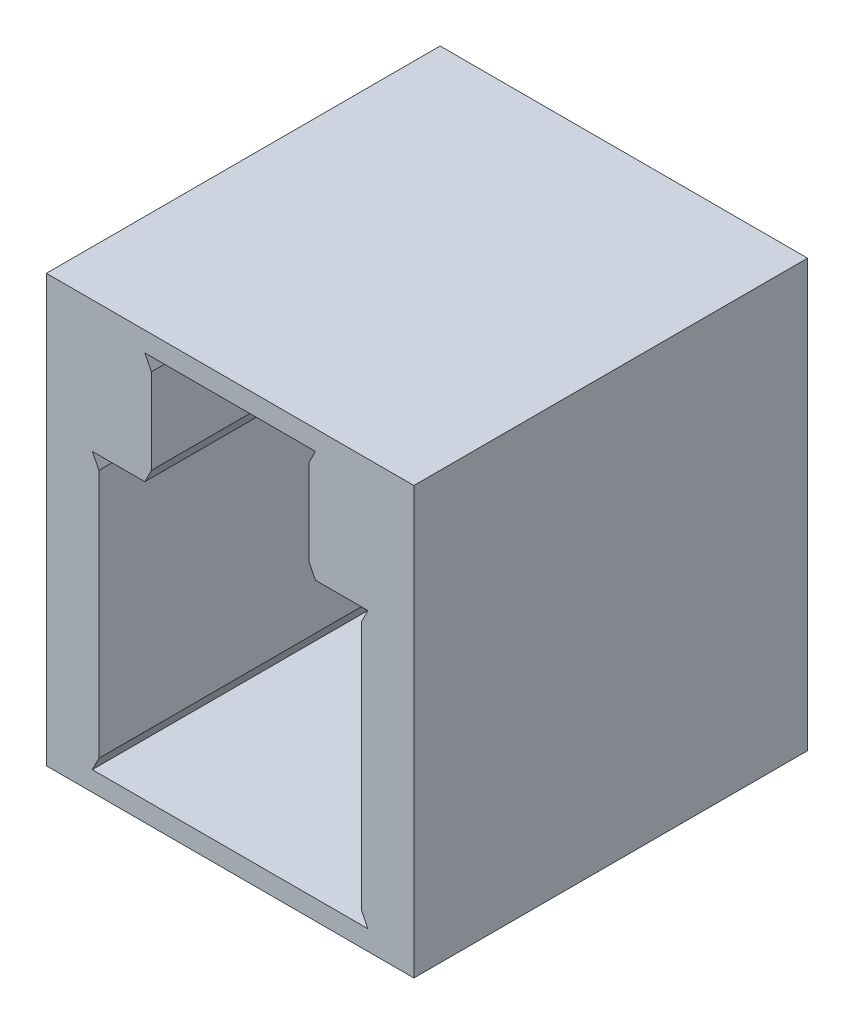
ISO-10303-21;
HEADER;
FILE_DESCRIPTION(('STEP AP214'),'2;1');
FILE_NAME('part.step','',(''),(''),'','','');
FILE_SCHEMA(('AUTOMOTIVE_DESIGN { 1 0 10303 214 1 1 1 1 }'));
ENDSEC;
DATA;
#1=APPLICATION_CONTEXT('core data for automotive mechanical design processes');
#2=APPLICATION_PROTOCOL_DEFINITION('international standard','automotive_design',2000,#1);
#3=PRODUCT_CONTEXT('',#1,'mechanical');
#4=PRODUCT('Part','Part','',(#3));
#5=PRODUCT_RELATED_PRODUCT_CATEGORY('part','',(#4));
#6=PRODUCT_DEFINITION_FORMATION('','',#4);
#7=PRODUCT_DEFINITION_CONTEXT('part definition',#1,'design');
#8=PRODUCT_DEFINITION('design','',#6,#7);
#9=PRODUCT_DEFINITION_SHAPE('','',#8);
#10=(LENGTH_UNIT() NAMED_UNIT(*) SI_UNIT(.MILLI.,.METRE.));
#11=(NAMED_UNIT(*) PLANE_ANGLE_UNIT() SI_UNIT($,.RADIAN.));
#12=(NAMED_UNIT(*) SI_UNIT($,.STERADIAN.) SOLID_ANGLE_UNIT());
#13=UNCERTAINTY_MEASURE_WITH_UNIT(LENGTH_MEASURE(1.E-05),#10,'distance_accuracy_value','');
#14=(GEOMETRIC_REPRESENTATION_CONTEXT(3) GLOBAL_UNCERTAINTY_ASSIGNED_CONTEXT((#13)) GLOBAL_UNIT_ASSIGNED_CONTEXT((#10,
#11,#12)) REPRESENTATION_CONTEXT('',''));
#15=CARTESIAN_POINT('',(0.,0.,0.));
#16=DIRECTION('',(0.,0.,1.));
#17=DIRECTION('',(1.,0.,0.));
#18=AXIS2_PLACEMENT_3D('',#15,#16,#17);
#19=CARTESIAN_POINT('',(4.,22.5,-30.));
#20=DIRECTION('',(0.,1.,0.));
#21=DIRECTION('',(-1.,0.,0.));
#22=AXIS2_PLACEMENT_3D('',#19,#20,#21);
#23=PLANE('',#22);
#24=DIRECTION('',(-1.,0.,0.));
#25=VECTOR('',#24,1.);
#26=CARTESIAN_POINT('',(4.,22.5,-30.));
#27=LINE('',#26,#25);
#28=CARTESIAN_POINT('',(7.5,22.5,-30.));
#29=VERTEX_POINT('',#28);
#30=CARTESIAN_POINT('',(3.5,22.5,-30.));
#31=VERTEX_POINT('',#30);
#32=EDGE_CURVE('E238',#29,#31,#27,.T.);
#33=ORIENTED_EDGE('',*,*,#32,.F.);
#34=DIRECTION('',(0.,0.,1.));
#35=VECTOR('',#34,1.);
#36=CARTESIAN_POINT('',(7.5,22.5,-30.));
#37=LINE('',#36,#35);
#38=CARTESIAN_POINT('',(7.5,22.5,0.));
#39=VERTEX_POINT('',#38);
#40=EDGE_CURVE('E371',#29,#39,#37,.T.);
#41=ORIENTED_EDGE('',*,*,#40,.T.);
#42=DIRECTION('',(1.,0.,0.));
#43=VECTOR('',#42,1.);
#44=CARTESIAN_POINT('',(0.,22.5,0.));
#45=LINE('',#44,#43);
#46=CARTESIAN_POINT('',(3.5,22.5,0.));
#47=VERTEX_POINT('',#46);
#48=EDGE_CURVE('E247',#47,#39,#45,.T.);
#49=ORIENTED_EDGE('',*,*,#48,.F.);
#50=DIRECTION('',(0.,0.,1.));
#51=VECTOR('',#50,1.);
#52=CARTESIAN_POINT('',(3.5,22.5,-30.));
#53=LINE('',#52,#51);
#54=EDGE_CURVE('E476',#31,#47,#53,.T.);
#55=ORIENTED_EDGE('',*,*,#54,.F.);
#56=EDGE_LOOP('',(#33,#41,#49,#55));
#57=FACE_BOUND('',#56,.T.);
#58=ADVANCED_FACE('F39',(#57),#23,.F.);
#59=CARTESIAN_POINT('',(0.,32.5,0.));
#60=DIRECTION('',(1.,0.,0.));
#61=DIRECTION('',(0.,0.,-1.));
#62=AXIS2_PLACEMENT_3D('',#59,#60,#61);
#63=PLANE('',#62);
#64=DIRECTION('',(0.,0.,1.));
#65=VECTOR('',#64,1.);
#66=CARTESIAN_POINT('',(0.,0.,0.));
#67=LINE('',#66,#65);
#68=CARTESIAN_POINT('',(0.,0.,-30.));
#69=VERTEX_POINT('',#68);
#70=CARTESIAN_POINT('',(0.,0.,0.));
#71=VERTEX_POINT('',#70);
#72=EDGE_CURVE('E267',#69,#71,#67,.T.);
#73=ORIENTED_EDGE('',*,*,#72,.T.);
#74=DIRECTION('',(0.,-1.,0.));
#75=VECTOR('',#74,1.);
#76=CARTESIAN_POINT('',(0.,32.5,0.));
#77=LINE('',#76,#75);
#78=CARTESIAN_POINT('',(0.,32.5,0.));
#79=VERTEX_POINT('',#78);
#80=EDGE_CURVE('E11',#79,#71,#77,.T.);
#81=ORIENTED_EDGE('',*,*,#80,.F.);
#82=DIRECTION('',(0.,0.,1.));
#83=VECTOR('',#82,1.);
#84=CARTESIAN_POINT('',(0.,32.5,0.));
#85=LINE('',#84,#83);
#86=CARTESIAN_POINT('',(0.,32.5,-30.));
#87=VERTEX_POINT('',#86);
#88=EDGE_CURVE('E252',#87,#79,#85,.T.);
#89=ORIENTED_EDGE('',*,*,#88,.F.);
#90=DIRECTION('',(0.,-1.,0.));
#91=VECTOR('',#90,1.);
#92=CARTESIAN_POINT('',(0.,32.5,-30.));
#93=LINE('',#92,#91);
#94=EDGE_CURVE('E266',#87,#69,#93,.T.);
#95=ORIENTED_EDGE('',*,*,#94,.T.);
#96=EDGE_LOOP('',(#73,#81,#89,#95));
#97=FACE_BOUND('',#96,.T.);
#98=ADVANCED_FACE('F41',(#97),#63,.F.);
#99=CARTESIAN_POINT('',(0.,32.5,0.));
#100=DIRECTION('',(0.,0.,-1.));
#101=DIRECTION('',(-1.,0.,0.));
#102=AXIS2_PLACEMENT_3D('',#99,#100,#101);
#103=PLANE('',#102);
#104=DIRECTION('',(0.,-1.,0.));
#105=VECTOR('',#104,1.);
#106=CARTESIAN_POINT('',(20.,32.5,0.));
#107=LINE('',#106,#105);
#108=CARTESIAN_POINT('',(20.,30.,0.));
#109=VERTEX_POINT('',#108);
#110=CARTESIAN_POINT('',(20.,23.5,0.));
#111=VERTEX_POINT('',#110);
#112=EDGE_CURVE('E212',#109,#111,#107,.T.);
#113=ORIENTED_EDGE('',*,*,#112,.T.);
#114=DIRECTION('',(0.447213595499958,-0.894427190999916,0.));
#115=VECTOR('',#114,1.);
#116=CARTESIAN_POINT('',(12.4,38.7,0.));
#117=LINE('',#116,#115);
#118=CARTESIAN_POINT('',(20.5,22.5,0.));
#119=VERTEX_POINT('',#118);
#120=EDGE_CURVE('E383',#111,#119,#117,.T.);
#121=ORIENTED_EDGE('',*,*,#120,.T.);
#122=CARTESIAN_POINT('',(24.5,22.5,0.));
#123=VERTEX_POINT('',#122);
#124=EDGE_CURVE('E249',#119,#123,#45,.T.);
#125=ORIENTED_EDGE('',*,*,#124,.T.);
#126=DIRECTION('',(-0.44721359549996,-0.894427190999915,0.));
#127=VECTOR('',#126,1.);
#128=CARTESIAN_POINT('',(23.6,20.6999999999999,0.));
#129=LINE('',#128,#127);
#130=CARTESIAN_POINT('',(24.,21.5,0.));
#131=VERTEX_POINT('',#130);
#132=EDGE_CURVE('E347',#123,#131,#129,.T.);
#133=ORIENTED_EDGE('',*,*,#132,.T.);
#134=DIRECTION('',(0.,-1.,0.));
#135=VECTOR('',#134,1.);
#136=CARTESIAN_POINT('',(24.,32.5,0.));
#137=LINE('',#136,#135);
#138=CARTESIAN_POINT('',(24.,2.5,6.E-06));
#139=VERTEX_POINT('',#138);
#140=EDGE_CURVE('E222',#131,#139,#137,.T.);
#141=ORIENTED_EDGE('',*,*,#140,.T.);
#142=DIRECTION('',(0.447213595499958,-0.894427190999916,0.));
#143=VECTOR('',#142,1.);
#144=CARTESIAN_POINT('',(7.19999999999999,36.1,0.));
#145=LINE('',#144,#143);
#146=CARTESIAN_POINT('',(24.5,1.5,0.));
#147=VERTEX_POINT('',#146);
#148=EDGE_CURVE('E192',#139,#147,#145,.T.);
#149=ORIENTED_EDGE('',*,*,#148,.T.);
#150=DIRECTION('',(-1.,0.,0.));
#151=VECTOR('',#150,1.);
#152=CARTESIAN_POINT('',(0.,1.5,0.));
#153=LINE('',#152,#151);
#154=CARTESIAN_POINT('',(3.49999999999999,1.5,0.));
#155=VERTEX_POINT('',#154);
#156=EDGE_CURVE('E243',#147,#155,#153,.T.);
#157=ORIENTED_EDGE('',*,*,#156,.T.);
#158=DIRECTION('',(0.447213595499961,0.894427190999915,0.));
#159=VECTOR('',#158,1.);
#160=CARTESIAN_POINT('',(15.2,24.8999999999999,0.));
#161=LINE('',#160,#159);
#162=CARTESIAN_POINT('',(4.,2.5,0.));
#163=VERTEX_POINT('',#162);
#164=EDGE_CURVE('E402',#155,#163,#161,.T.);
#165=ORIENTED_EDGE('',*,*,#164,.T.);
#166=DIRECTION('',(0.,1.,0.));
#167=VECTOR('',#166,1.);
#168=CARTESIAN_POINT('',(4.,32.5,0.));
#169=LINE('',#168,#167);
#170=CARTESIAN_POINT('',(4.,21.5,6.E-06));
#171=VERTEX_POINT('',#170);
#172=EDGE_CURVE('E43',#163,#171,#169,.T.);
#173=ORIENTED_EDGE('',*,*,#172,.T.);
#174=DIRECTION('',(-0.447213595499958,0.894427190999916,0.));
#175=VECTOR('',#174,1.);
#176=CARTESIAN_POINT('',(-1.2,31.9,0.));
#177=LINE('',#176,#175);
#178=EDGE_CURVE('E408',#171,#47,#177,.T.);
#179=ORIENTED_EDGE('',*,*,#178,.T.);
#180=ORIENTED_EDGE('',*,*,#48,.T.);
#181=DIRECTION('',(0.447213595499958,0.894427190999916,0.));
#182=VECTOR('',#181,1.);
#183=CARTESIAN_POINT('',(10.,27.5,0.));
#184=LINE('',#183,#182);
#185=CARTESIAN_POINT('',(8.,23.5,0.));
#186=VERTEX_POINT('',#185);
#187=EDGE_CURVE('E193',#39,#186,#184,.T.);
#188=ORIENTED_EDGE('',*,*,#187,.T.);
#189=DIRECTION('',(0.,1.,0.));
#190=VECTOR('',#189,1.);
#191=CARTESIAN_POINT('',(8.,32.5,0.));
#192=LINE('',#191,#190);
#193=CARTESIAN_POINT('',(8.,30.,6.E-06));
#194=VERTEX_POINT('',#193);
#195=EDGE_CURVE('E199',#186,#194,#192,.T.);
#196=ORIENTED_EDGE('',*,*,#195,.T.);
#197=DIRECTION('',(-0.447213595499957,0.894427190999917,0.));
#198=VECTOR('',#197,1.);
#199=CARTESIAN_POINT('',(5.40000000000001,35.2,0.));
#200=LINE('',#199,#198);
#201=CARTESIAN_POINT('',(7.5,31.,0.));
#202=VERTEX_POINT('',#201);
#203=EDGE_CURVE('E181',#194,#202,#200,.T.);
#204=ORIENTED_EDGE('',*,*,#203,.T.);
#205=DIRECTION('',(1.,0.,0.));
#206=VECTOR('',#205,1.);
#207=CARTESIAN_POINT('',(0.,31.,0.));
#208=LINE('',#207,#206);
#209=CARTESIAN_POINT('',(20.5,31.,0.));
#210=VERTEX_POINT('',#209);
#211=EDGE_CURVE('E211',#202,#210,#208,.T.);
#212=ORIENTED_EDGE('',*,*,#211,.T.);
#213=DIRECTION('',(-0.447213595499958,-0.894427190999916,0.));
#214=VECTOR('',#213,1.);
#215=CARTESIAN_POINT('',(17.,24.,0.));
#216=LINE('',#215,#214);
#217=EDGE_CURVE('E375',#210,#109,#216,.T.);
#218=ORIENTED_EDGE('',*,*,#217,.T.);
#219=EDGE_LOOP('',(#113,#121,#125,#133,#141,#149,#157,#165,#173,#179,#180,#188,#196,#204,#212,#218));
#220=FACE_BOUND('',#219,.T.);
#221=DIRECTION('',(1.,0.,0.));
#222=VECTOR('',#221,1.);
#223=CARTESIAN_POINT('',(0.,0.,0.));
#224=LINE('',#223,#222);
#225=CARTESIAN_POINT('',(28.,0.,0.));
#226=VERTEX_POINT('',#225);
#227=EDGE_CURVE('E271',#71,#226,#224,.T.);
#228=ORIENTED_EDGE('',*,*,#227,.T.);
#229=DIRECTION('',(0.,-1.,0.));
#230=VECTOR('',#229,1.);
#231=CARTESIAN_POINT('',(28.,32.5,0.));
#232=LINE('',#231,#230);
#233=CARTESIAN_POINT('',(28.,32.5,0.));
#234=VERTEX_POINT('',#233);
#235=EDGE_CURVE('E50',#234,#226,#232,.T.);
#236=ORIENTED_EDGE('',*,*,#235,.F.);
#237=DIRECTION('',(1.,0.,0.));
#238=VECTOR('',#237,1.);
#239=CARTESIAN_POINT('',(0.,32.5,0.));
#240=LINE('',#239,#238);
#241=EDGE_CURVE('E256',#79,#234,#240,.T.);
#242=ORIENTED_EDGE('',*,*,#241,.F.);
#243=ORIENTED_EDGE('',*,*,#80,.T.);
#244=EDGE_LOOP('',(#228,#236,#242,#243));
#245=FACE_BOUND('',#244,.T.);
#246=ADVANCED_FACE('F207',(#220,#245),#103,.F.);
#247=CARTESIAN_POINT('',(28.,32.5,0.));
#248=DIRECTION('',(-1.,0.,0.));
#249=DIRECTION('',(0.,0.,1.));
#250=AXIS2_PLACEMENT_3D('',#247,#248,#249);
#251=PLANE('',#250);
#252=DIRECTION('',(0.,0.,-1.));
#253=VECTOR('',#252,1.);
#254=CARTESIAN_POINT('',(28.,0.,0.));
#255=LINE('',#254,#253);
#256=CARTESIAN_POINT('',(28.,0.,-30.));
#257=VERTEX_POINT('',#256);
#258=EDGE_CURVE('E274',#226,#257,#255,.T.);
#259=ORIENTED_EDGE('',*,*,#258,.T.);
#260=DIRECTION('',(0.,-1.,0.));
#261=VECTOR('',#260,1.);
#262=CARTESIAN_POINT('',(28.,32.5,-30.));
#263=LINE('',#262,#261);
#264=CARTESIAN_POINT('',(28.,32.5,-30.));
#265=VERTEX_POINT('',#264);
#266=EDGE_CURVE('E282',#265,#257,#263,.T.);
#267=ORIENTED_EDGE('',*,*,#266,.F.);
#268=DIRECTION('',(0.,0.,-1.));
#269=VECTOR('',#268,1.);
#270=CARTESIAN_POINT('',(28.,32.5,0.));
#271=LINE('',#270,#269);
#272=EDGE_CURVE('E260',#234,#265,#271,.T.);
#273=ORIENTED_EDGE('',*,*,#272,.F.);
#274=ORIENTED_EDGE('',*,*,#235,.T.);
#275=EDGE_LOOP('',(#259,#267,#273,#274));
#276=FACE_BOUND('',#275,.T.);
#277=ADVANCED_FACE('F292',(#276),#251,.F.);
#278=CARTESIAN_POINT('',(0.,32.5,-30.));
#279=DIRECTION('',(0.,0.,1.));
#280=DIRECTION('',(1.,0.,0.));
#281=AXIS2_PLACEMENT_3D('',#278,#279,#280);
#282=PLANE('',#281);
#283=CARTESIAN_POINT('',(24.5,22.5,-30.));
#284=VERTEX_POINT('',#283);
#285=CARTESIAN_POINT('',(20.5,22.5,-30.));
#286=VERTEX_POINT('',#285);
#287=EDGE_CURVE('E239',#284,#286,#27,.T.);
#288=ORIENTED_EDGE('',*,*,#287,.T.);
#289=DIRECTION('',(-0.447213595499958,0.894427190999916,0.));
#290=VECTOR('',#289,1.);
#291=CARTESIAN_POINT('',(20.,23.5,-30.));
#292=LINE('',#291,#290);
#293=CARTESIAN_POINT('',(20.,23.5,-30.));
#294=VERTEX_POINT('',#293);
#295=EDGE_CURVE('E460',#286,#294,#292,.T.);
#296=ORIENTED_EDGE('',*,*,#295,.T.);
#297=DIRECTION('',(0.,1.,0.));
#298=VECTOR('',#297,1.);
#299=CARTESIAN_POINT('',(20.,22.5,-30.));
#300=LINE('',#299,#298);
#301=CARTESIAN_POINT('',(20.,30.,-30.));
#302=VERTEX_POINT('',#301);
#303=EDGE_CURVE('E418',#294,#302,#300,.T.);
#304=ORIENTED_EDGE('',*,*,#303,.T.);
#305=DIRECTION('',(0.447213595499958,0.894427190999916,0.));
#306=VECTOR('',#305,1.);
#307=CARTESIAN_POINT('',(20.5,31.,-30.));
#308=LINE('',#307,#306);
#309=CARTESIAN_POINT('',(20.5,31.,-30.));
#310=VERTEX_POINT('',#309);
#311=EDGE_CURVE('E425',#302,#310,#308,.T.);
#312=ORIENTED_EDGE('',*,*,#311,.T.);
#313=DIRECTION('',(-1.,0.,0.));
#314=VECTOR('',#313,1.);
#315=CARTESIAN_POINT('',(8.,31.,-30.));
#316=LINE('',#315,#314);
#317=CARTESIAN_POINT('',(7.5,31.,-30.));
#318=VERTEX_POINT('',#317);
#319=EDGE_CURVE('E218',#310,#318,#316,.T.);
#320=ORIENTED_EDGE('',*,*,#319,.T.);
#321=DIRECTION('',(0.447213595499957,-0.894427190999916,0.));
#322=VECTOR('',#321,1.);
#323=CARTESIAN_POINT('',(7.5,31.,-30.));
#324=LINE('',#323,#322);
#325=CARTESIAN_POINT('',(8.,30.,-30.));
#326=VERTEX_POINT('',#325);
#327=EDGE_CURVE('E424',#318,#326,#324,.T.);
#328=ORIENTED_EDGE('',*,*,#327,.T.);
#329=DIRECTION('',(0.,-1.,0.));
#330=VECTOR('',#329,1.);
#331=CARTESIAN_POINT('',(8.,22.5,-30.));
#332=LINE('',#331,#330);
#333=CARTESIAN_POINT('',(8.,23.5,-30.));
#334=VERTEX_POINT('',#333);
#335=EDGE_CURVE('E201',#326,#334,#332,.T.);
#336=ORIENTED_EDGE('',*,*,#335,.T.);
#337=DIRECTION('',(-0.447213595499958,-0.894427190999916,0.));
#338=VECTOR('',#337,1.);
#339=CARTESIAN_POINT('',(8.,23.5,-30.));
#340=LINE('',#339,#338);
#341=EDGE_CURVE('E66',#334,#29,#340,.T.);
#342=ORIENTED_EDGE('',*,*,#341,.T.);
#343=ORIENTED_EDGE('',*,*,#32,.T.);
#344=DIRECTION('',(0.447213595499958,-0.894427190999916,0.));
#345=VECTOR('',#344,1.);
#346=CARTESIAN_POINT('',(3.5,22.5,-30.));
#347=LINE('',#346,#345);
#348=CARTESIAN_POINT('',(4.,21.5,-30.));
#349=VERTEX_POINT('',#348);
#350=EDGE_CURVE('E472',#31,#349,#347,.T.);
#351=ORIENTED_EDGE('',*,*,#350,.T.);
#352=DIRECTION('',(0.,-1.,0.));
#353=VECTOR('',#352,1.);
#354=CARTESIAN_POINT('',(4.,1.5,-30.));
#355=LINE('',#354,#353);
#356=CARTESIAN_POINT('',(4.,2.5,-30.));
#357=VERTEX_POINT('',#356);
#358=EDGE_CURVE('E216',#349,#357,#355,.T.);
#359=ORIENTED_EDGE('',*,*,#358,.T.);
#360=DIRECTION('',(-0.447213595499961,-0.894427190999915,0.));
#361=VECTOR('',#360,1.);
#362=CARTESIAN_POINT('',(3.49999999999999,1.5,-30.));
#363=LINE('',#362,#361);
#364=CARTESIAN_POINT('',(3.49999999999999,1.5,-30.));
#365=VERTEX_POINT('',#364);
#366=EDGE_CURVE('E442',#357,#365,#363,.T.);
#367=ORIENTED_EDGE('',*,*,#366,.T.);
#368=DIRECTION('',(1.,0.,0.));
#369=VECTOR('',#368,1.);
#370=CARTESIAN_POINT('',(4.,1.5,-30.));
#371=LINE('',#370,#369);
#372=CARTESIAN_POINT('',(24.5,1.5,-30.));
#373=VERTEX_POINT('',#372);
#374=EDGE_CURVE('E231',#365,#373,#371,.T.);
#375=ORIENTED_EDGE('',*,*,#374,.T.);
#376=DIRECTION('',(-0.447213595499958,0.894427190999916,0.));
#377=VECTOR('',#376,1.);
#378=CARTESIAN_POINT('',(24.5,1.5,-30.));
#379=LINE('',#378,#377);
#380=CARTESIAN_POINT('',(24.,2.5,-30.));
#381=VERTEX_POINT('',#380);
#382=EDGE_CURVE('E203',#373,#381,#379,.T.);
#383=ORIENTED_EDGE('',*,*,#382,.T.);
#384=DIRECTION('',(0.,1.,0.));
#385=VECTOR('',#384,1.);
#386=CARTESIAN_POINT('',(24.,1.5,-30.));
#387=LINE('',#386,#385);
#388=CARTESIAN_POINT('',(24.,21.5,-30.));
#389=VERTEX_POINT('',#388);
#390=EDGE_CURVE('E234',#381,#389,#387,.T.);
#391=ORIENTED_EDGE('',*,*,#390,.T.);
#392=DIRECTION('',(0.44721359549996,0.894427190999915,0.));
#393=VECTOR('',#392,1.);
#394=CARTESIAN_POINT('',(24.5,22.5,-30.));
#395=LINE('',#394,#393);
#396=EDGE_CURVE('E58',#389,#284,#395,.T.);
#397=ORIENTED_EDGE('',*,*,#396,.T.);
#398=EDGE_LOOP('',(#288,#296,#304,#312,#320,#328,#336,#342,#343,#351,#359,#367,#375,#383,#391,#397));
#399=FACE_BOUND('',#398,.T.);
#400=DIRECTION('',(-1.,0.,0.));
#401=VECTOR('',#400,1.);
#402=CARTESIAN_POINT('',(0.,0.,-30.));
#403=LINE('',#402,#401);
#404=EDGE_CURVE('E257',#257,#69,#403,.T.);
#405=ORIENTED_EDGE('',*,*,#404,.T.);
#406=ORIENTED_EDGE('',*,*,#94,.F.);
#407=DIRECTION('',(-1.,0.,0.));
#408=VECTOR('',#407,1.);
#409=CARTESIAN_POINT('',(0.,32.5,-30.));
#410=LINE('',#409,#408);
#411=EDGE_CURVE('E263',#265,#87,#410,.T.);
#412=ORIENTED_EDGE('',*,*,#411,.F.);
#413=ORIENTED_EDGE('',*,*,#266,.T.);
#414=EDGE_LOOP('',(#405,#406,#412,#413));
#415=FACE_BOUND('',#414,.T.);
#416=ADVANCED_FACE('F300',(#399,#415),#282,.F.);
#417=CARTESIAN_POINT('',(0.,32.5,0.));
#418=DIRECTION('',(0.,-1.,0.));
#419=DIRECTION('',(0.,0.,-1.));
#420=AXIS2_PLACEMENT_3D('',#417,#418,#419);
#421=PLANE('',#420);
#422=ORIENTED_EDGE('',*,*,#88,.T.);
#423=ORIENTED_EDGE('',*,*,#241,.T.);
#424=ORIENTED_EDGE('',*,*,#272,.T.);
#425=ORIENTED_EDGE('',*,*,#411,.T.);
#426=EDGE_LOOP('',(#422,#423,#424,#425));
#427=FACE_BOUND('',#426,.T.);
#428=ADVANCED_FACE('F306',(#427),#421,.F.);
#429=CARTESIAN_POINT('',(0.,0.,0.));
#430=DIRECTION('',(0.,-1.,0.));
#431=DIRECTION('',(0.,0.,-1.));
#432=AXIS2_PLACEMENT_3D('',#429,#430,#431);
#433=PLANE('',#432);
#434=ORIENTED_EDGE('',*,*,#72,.F.);
#435=ORIENTED_EDGE('',*,*,#404,.F.);
#436=ORIENTED_EDGE('',*,*,#258,.F.);
#437=ORIENTED_EDGE('',*,*,#227,.F.);
#438=EDGE_LOOP('',(#434,#435,#436,#437));
#439=FACE_BOUND('',#438,.T.);
#440=ADVANCED_FACE('F297',(#439),#433,.T.);
#441=CARTESIAN_POINT('',(4.,1.5,-30.));
#442=DIRECTION('',(-1.,0.,0.));
#443=DIRECTION('',(0.,0.,1.));
#444=AXIS2_PLACEMENT_3D('',#441,#442,#443);
#445=PLANE('',#444);
#446=ORIENTED_EDGE('',*,*,#358,.F.);
#447=DIRECTION('',(0.,0.,1.));
#448=VECTOR('',#447,1.);
#449=CARTESIAN_POINT('',(4.,21.5,-30.));
#450=LINE('',#449,#448);
#451=EDGE_CURVE('E464',#349,#171,#450,.T.);
#452=ORIENTED_EDGE('',*,*,#451,.T.);
#453=ORIENTED_EDGE('',*,*,#172,.F.);
#454=DIRECTION('',(0.,0.,1.));
#455=VECTOR('',#454,1.);
#456=CARTESIAN_POINT('',(4.,2.5,-30.));
#457=LINE('',#456,#455);
#458=EDGE_CURVE('E437',#357,#163,#457,.T.);
#459=ORIENTED_EDGE('',*,*,#458,.F.);
#460=EDGE_LOOP('',(#446,#452,#453,#459));
#461=FACE_BOUND('',#460,.T.);
#462=ADVANCED_FACE('F324',(#461),#445,.F.);
#463=ORIENTED_EDGE('',*,*,#124,.F.);
#464=DIRECTION('',(0.,0.,1.));
#465=VECTOR('',#464,1.);
#466=CARTESIAN_POINT('',(20.5,22.5,-30.));
#467=LINE('',#466,#465);
#468=EDGE_CURVE('E337',#286,#119,#467,.T.);
#469=ORIENTED_EDGE('',*,*,#468,.F.);
#470=ORIENTED_EDGE('',*,*,#287,.F.);
#471=DIRECTION('',(0.,0.,1.));
#472=VECTOR('',#471,1.);
#473=CARTESIAN_POINT('',(24.5,22.5,-30.));
#474=LINE('',#473,#472);
#475=EDGE_CURVE('E338',#284,#123,#474,.T.);
#476=ORIENTED_EDGE('',*,*,#475,.T.);
#477=EDGE_LOOP('',(#463,#469,#470,#476));
#478=FACE_BOUND('',#477,.T.);
#479=ADVANCED_FACE('F316',(#478),#23,.F.);
#480=CARTESIAN_POINT('',(24.,1.5,-30.));
#481=DIRECTION('',(1.,0.,0.));
#482=DIRECTION('',(0.,1.,0.));
#483=AXIS2_PLACEMENT_3D('',#480,#481,#482);
#484=PLANE('',#483);
#485=ORIENTED_EDGE('',*,*,#140,.F.);
#486=DIRECTION('',(0.,0.,1.));
#487=VECTOR('',#486,1.);
#488=CARTESIAN_POINT('',(24.,21.5,-30.));
#489=LINE('',#488,#487);
#490=EDGE_CURVE('E350',#389,#131,#489,.T.);
#491=ORIENTED_EDGE('',*,*,#490,.F.);
#492=ORIENTED_EDGE('',*,*,#390,.F.);
#493=DIRECTION('',(0.,0.,1.));
#494=VECTOR('',#493,1.);
#495=CARTESIAN_POINT('',(24.,2.5,-30.));
#496=LINE('',#495,#494);
#497=EDGE_CURVE('E351',#381,#139,#496,.T.);
#498=ORIENTED_EDGE('',*,*,#497,.T.);
#499=EDGE_LOOP('',(#485,#491,#492,#498));
#500=FACE_BOUND('',#499,.T.);
#501=ADVANCED_FACE('F323',(#500),#484,.F.);
#502=CARTESIAN_POINT('',(4.,1.5,-30.));
#503=DIRECTION('',(0.,-1.,0.));
#504=DIRECTION('',(1.,0.,0.));
#505=AXIS2_PLACEMENT_3D('',#502,#503,#504);
#506=PLANE('',#505);
#507=ORIENTED_EDGE('',*,*,#156,.F.);
#508=DIRECTION('',(0.,0.,1.));
#509=VECTOR('',#508,1.);
#510=CARTESIAN_POINT('',(24.5,1.5,-30.));
#511=LINE('',#510,#509);
#512=EDGE_CURVE('E356',#373,#147,#511,.T.);
#513=ORIENTED_EDGE('',*,*,#512,.F.);
#514=ORIENTED_EDGE('',*,*,#374,.F.);
#515=DIRECTION('',(0.,0.,1.));
#516=VECTOR('',#515,1.);
#517=CARTESIAN_POINT('',(3.49999999999999,1.5,-30.));
#518=LINE('',#517,#516);
#519=EDGE_CURVE('E433',#365,#155,#518,.T.);
#520=ORIENTED_EDGE('',*,*,#519,.T.);
#521=EDGE_LOOP('',(#507,#513,#514,#520));
#522=FACE_BOUND('',#521,.T.);
#523=ADVANCED_FACE('F330',(#522),#506,.F.);
#524=CARTESIAN_POINT('',(8.,31.,-30.));
#525=DIRECTION('',(0.,1.,0.));
#526=DIRECTION('',(0.,0.,1.));
#527=AXIS2_PLACEMENT_3D('',#524,#525,#526);
#528=PLANE('',#527);
#529=ORIENTED_EDGE('',*,*,#211,.F.);
#530=DIRECTION('',(0.,0.,1.));
#531=VECTOR('',#530,1.);
#532=CARTESIAN_POINT('',(7.5,31.,-30.));
#533=LINE('',#532,#531);
#534=EDGE_CURVE('E188',#318,#202,#533,.T.);
#535=ORIENTED_EDGE('',*,*,#534,.F.);
#536=ORIENTED_EDGE('',*,*,#319,.F.);
#537=DIRECTION('',(0.,0.,1.));
#538=VECTOR('',#537,1.);
#539=CARTESIAN_POINT('',(20.5,31.,-30.));
#540=LINE('',#539,#538);
#541=EDGE_CURVE('E445',#310,#210,#540,.T.);
#542=ORIENTED_EDGE('',*,*,#541,.T.);
#543=EDGE_LOOP('',(#529,#535,#536,#542));
#544=FACE_BOUND('',#543,.T.);
#545=ADVANCED_FACE('F429',(#544),#528,.F.);
#546=CARTESIAN_POINT('',(8.,22.5,-30.));
#547=DIRECTION('',(-1.,0.,0.));
#548=DIRECTION('',(0.,-1.,0.));
#549=AXIS2_PLACEMENT_3D('',#546,#547,#548);
#550=PLANE('',#549);
#551=ORIENTED_EDGE('',*,*,#335,.F.);
#552=DIRECTION('',(0.,0.,1.));
#553=VECTOR('',#552,1.);
#554=CARTESIAN_POINT('',(8.,30.,-30.));
#555=LINE('',#554,#553);
#556=EDGE_CURVE('E185',#326,#194,#555,.T.);
#557=ORIENTED_EDGE('',*,*,#556,.T.);
#558=ORIENTED_EDGE('',*,*,#195,.F.);
#559=DIRECTION('',(0.,0.,1.));
#560=VECTOR('',#559,1.);
#561=CARTESIAN_POINT('',(8.,23.5,-30.));
#562=LINE('',#561,#560);
#563=EDGE_CURVE('E369',#334,#186,#562,.T.);
#564=ORIENTED_EDGE('',*,*,#563,.F.);
#565=EDGE_LOOP('',(#551,#557,#558,#564));
#566=FACE_BOUND('',#565,.T.);
#567=ADVANCED_FACE('F198',(#566),#550,.F.);
#568=CARTESIAN_POINT('',(20.,22.5,-30.));
#569=DIRECTION('',(1.,0.,0.));
#570=DIRECTION('',(0.,1.,0.));
#571=AXIS2_PLACEMENT_3D('',#568,#569,#570);
#572=PLANE('',#571);
#573=ORIENTED_EDGE('',*,*,#303,.F.);
#574=DIRECTION('',(0.,0.,1.));
#575=VECTOR('',#574,1.);
#576=CARTESIAN_POINT('',(20.,23.5,-30.));
#577=LINE('',#576,#575);
#578=EDGE_CURVE('E370',#294,#111,#577,.T.);
#579=ORIENTED_EDGE('',*,*,#578,.T.);
#580=ORIENTED_EDGE('',*,*,#112,.F.);
#581=DIRECTION('',(0.,0.,1.));
#582=VECTOR('',#581,1.);
#583=CARTESIAN_POINT('',(20.,30.,-30.));
#584=LINE('',#583,#582);
#585=EDGE_CURVE('E453',#302,#109,#584,.T.);
#586=ORIENTED_EDGE('',*,*,#585,.F.);
#587=EDGE_LOOP('',(#573,#579,#580,#586));
#588=FACE_BOUND('',#587,.T.);
#589=ADVANCED_FACE('F524',(#588),#572,.F.);
#590=CARTESIAN_POINT('',(20.5,31.,-30.));
#591=DIRECTION('',(0.894427190999916,-0.447213595499958,0.));
#592=DIRECTION('',(0.447213595499958,0.894427190999916,0.));
#593=AXIS2_PLACEMENT_3D('',#590,#591,#592);
#594=PLANE('',#593);
#595=ORIENTED_EDGE('',*,*,#541,.F.);
#596=ORIENTED_EDGE('',*,*,#311,.F.);
#597=ORIENTED_EDGE('',*,*,#585,.T.);
#598=ORIENTED_EDGE('',*,*,#217,.F.);
#599=EDGE_LOOP('',(#595,#596,#597,#598));
#600=FACE_BOUND('',#599,.T.);
#601=ADVANCED_FACE('F516',(#600),#594,.F.);
#602=CARTESIAN_POINT('',(20.,23.5,-30.));
#603=DIRECTION('',(0.894427190999916,0.447213595499958,0.));
#604=DIRECTION('',(-0.447213595499958,0.894427190999916,0.));
#605=AXIS2_PLACEMENT_3D('',#602,#603,#604);
#606=PLANE('',#605);
#607=ORIENTED_EDGE('',*,*,#578,.F.);
#608=ORIENTED_EDGE('',*,*,#295,.F.);
#609=ORIENTED_EDGE('',*,*,#468,.T.);
#610=ORIENTED_EDGE('',*,*,#120,.F.);
#611=EDGE_LOOP('',(#607,#608,#609,#610));
#612=FACE_BOUND('',#611,.T.);
#613=ADVANCED_FACE('F509',(#612),#606,.F.);
#614=CARTESIAN_POINT('',(8.,23.5,-30.));
#615=DIRECTION('',(-0.894427190999916,0.447213595499958,0.));
#616=DIRECTION('',(-0.447213595499958,-0.894427190999916,0.));
#617=AXIS2_PLACEMENT_3D('',#614,#615,#616);
#618=PLANE('',#617);
#619=ORIENTED_EDGE('',*,*,#40,.F.);
#620=ORIENTED_EDGE('',*,*,#341,.F.);
#621=ORIENTED_EDGE('',*,*,#563,.T.);
#622=ORIENTED_EDGE('',*,*,#187,.F.);
#623=EDGE_LOOP('',(#619,#620,#621,#622));
#624=FACE_BOUND('',#623,.T.);
#625=ADVANCED_FACE('F507',(#624),#618,.F.);
#626=CARTESIAN_POINT('',(7.5,31.,-30.));
#627=DIRECTION('',(-0.894427190999917,-0.447213595499957,0.));
#628=DIRECTION('',(0.447213595499957,-0.894427190999917,0.));
#629=AXIS2_PLACEMENT_3D('',#626,#627,#628);
#630=PLANE('',#629);
#631=ORIENTED_EDGE('',*,*,#556,.F.);
#632=ORIENTED_EDGE('',*,*,#327,.F.);
#633=ORIENTED_EDGE('',*,*,#534,.T.);
#634=ORIENTED_EDGE('',*,*,#203,.F.);
#635=EDGE_LOOP('',(#631,#632,#633,#634));
#636=FACE_BOUND('',#635,.T.);
#637=ADVANCED_FACE('F183',(#636),#630,.F.);
#638=CARTESIAN_POINT('',(3.49999999999999,1.5,-30.));
#639=DIRECTION('',(-0.894427190999915,0.447213595499961,0.));
#640=DIRECTION('',(-0.447213595499961,-0.894427190999915,0.));
#641=AXIS2_PLACEMENT_3D('',#638,#639,#640);
#642=PLANE('',#641);
#643=ORIENTED_EDGE('',*,*,#519,.F.);
#644=ORIENTED_EDGE('',*,*,#366,.F.);
#645=ORIENTED_EDGE('',*,*,#458,.T.);
#646=ORIENTED_EDGE('',*,*,#164,.F.);
#647=EDGE_LOOP('',(#643,#644,#645,#646));
#648=FACE_BOUND('',#647,.T.);
#649=ADVANCED_FACE('F499',(#648),#642,.F.);
#650=CARTESIAN_POINT('',(24.5,1.5,-30.));
#651=DIRECTION('',(0.894427190999916,0.447213595499958,0.));
#652=DIRECTION('',(-0.447213595499958,0.894427190999916,0.));
#653=AXIS2_PLACEMENT_3D('',#650,#651,#652);
#654=PLANE('',#653);
#655=ORIENTED_EDGE('',*,*,#497,.F.);
#656=ORIENTED_EDGE('',*,*,#382,.F.);
#657=ORIENTED_EDGE('',*,*,#512,.T.);
#658=ORIENTED_EDGE('',*,*,#148,.F.);
#659=EDGE_LOOP('',(#655,#656,#657,#658));
#660=FACE_BOUND('',#659,.T.);
#661=ADVANCED_FACE('F492',(#660),#654,.F.);
#662=CARTESIAN_POINT('',(24.5,22.5,-30.));
#663=DIRECTION('',(0.894427190999915,-0.44721359549996,0.));
#664=DIRECTION('',(0.44721359549996,0.894427190999915,0.));
#665=AXIS2_PLACEMENT_3D('',#662,#663,#664);
#666=PLANE('',#665);
#667=ORIENTED_EDGE('',*,*,#475,.F.);
#668=ORIENTED_EDGE('',*,*,#396,.F.);
#669=ORIENTED_EDGE('',*,*,#490,.T.);
#670=ORIENTED_EDGE('',*,*,#132,.F.);
#671=EDGE_LOOP('',(#667,#668,#669,#670));
#672=FACE_BOUND('',#671,.T.);
#673=ADVANCED_FACE('F575',(#672),#666,.F.);
#674=CARTESIAN_POINT('',(3.5,22.5,-30.));
#675=DIRECTION('',(-0.894427190999916,-0.447213595499958,0.));
#676=DIRECTION('',(0.447213595499958,-0.894427190999916,0.));
#677=AXIS2_PLACEMENT_3D('',#674,#675,#676);
#678=PLANE('',#677);
#679=ORIENTED_EDGE('',*,*,#451,.F.);
#680=ORIENTED_EDGE('',*,*,#350,.F.);
#681=ORIENTED_EDGE('',*,*,#54,.T.);
#682=ORIENTED_EDGE('',*,*,#178,.F.);
#683=EDGE_LOOP('',(#679,#680,#681,#682));
#684=FACE_BOUND('',#683,.T.);
#685=ADVANCED_FACE('F505',(#684),#678,.F.);
#686=CLOSED_SHELL('',(#58,#98,#246,#277,#416,#428,#440,#462,#479,#501,#523,#545,#567,#589,#601,
#613,#625,#637,#649,#661,#673,#685));
#687=MANIFOLD_SOLID_BREP('B2',#686);
#688=ADVANCED_BREP_SHAPE_REPRESENTATION('',(#18,#687),#14);
#689=SHAPE_DEFINITION_REPRESENTATION(#9,#688);
ENDSEC;
END-ISO-10303-21;
